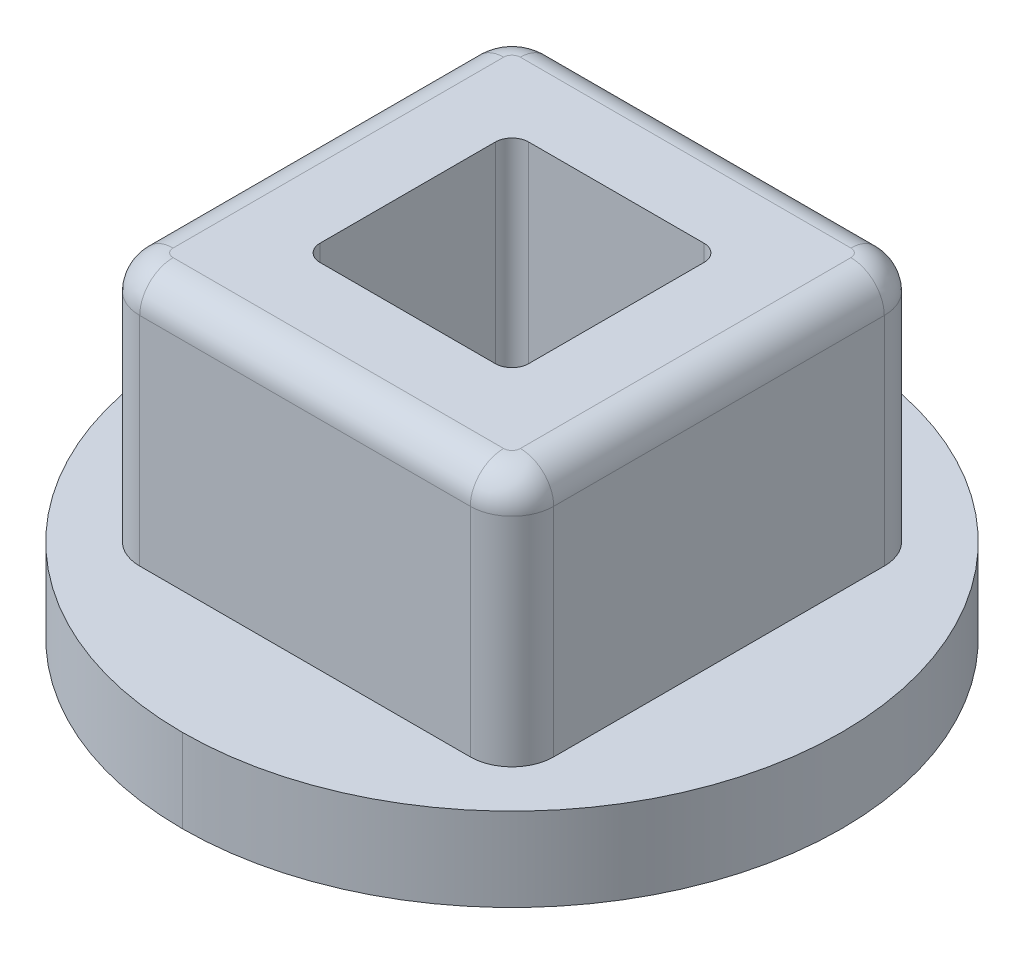
ISO-10303-21;
HEADER;
FILE_DESCRIPTION(('STEP AP214'),'2;1');
FILE_NAME('part.step','',(''),(''),'','','');
FILE_SCHEMA(('AUTOMOTIVE_DESIGN { 1 0 10303 214 1 1 1 1 }'));
ENDSEC;
DATA;
#1=APPLICATION_CONTEXT('core data for automotive mechanical design processes');
#2=APPLICATION_PROTOCOL_DEFINITION('international standard','automotive_design',2000,#1);
#3=PRODUCT_CONTEXT('',#1,'mechanical');
#4=PRODUCT('Part','Part','',(#3));
#5=PRODUCT_RELATED_PRODUCT_CATEGORY('part','',(#4));
#6=PRODUCT_DEFINITION_FORMATION('','',#4);
#7=PRODUCT_DEFINITION_CONTEXT('part definition',#1,'design');
#8=PRODUCT_DEFINITION('design','',#6,#7);
#9=PRODUCT_DEFINITION_SHAPE('','',#8);
#10=(LENGTH_UNIT() NAMED_UNIT(*) SI_UNIT(.MILLI.,.METRE.));
#11=(NAMED_UNIT(*) PLANE_ANGLE_UNIT() SI_UNIT($,.RADIAN.));
#12=(NAMED_UNIT(*) SI_UNIT($,.STERADIAN.) SOLID_ANGLE_UNIT());
#13=UNCERTAINTY_MEASURE_WITH_UNIT(LENGTH_MEASURE(1.E-05),#10,'distance_accuracy_value','');
#14=(GEOMETRIC_REPRESENTATION_CONTEXT(3) GLOBAL_UNCERTAINTY_ASSIGNED_CONTEXT((#13)) GLOBAL_UNIT_ASSIGNED_CONTEXT((#10,
#11,#12)) REPRESENTATION_CONTEXT('',''));
#15=CARTESIAN_POINT('',(0.,0.,0.));
#16=DIRECTION('',(0.,0.,1.));
#17=DIRECTION('',(1.,0.,0.));
#18=AXIS2_PLACEMENT_3D('',#15,#16,#17);
#19=CARTESIAN_POINT('',(-2.5146,5.08,-2.5146));
#20=DIRECTION('',(0.,-1.,0.));
#21=DIRECTION('',(0.,0.,-1.));
#22=AXIS2_PLACEMENT_3D('',#19,#20,#21);
#23=CYLINDRICAL_SURFACE('',#22,0.635);
#24=DIRECTION('',(0.,1.,0.));
#25=VECTOR('',#24,1.);
#26=CARTESIAN_POINT('',(-3.1496,5.08,-2.5146));
#27=LINE('',#26,#25);
#28=CARTESIAN_POINT('',(-3.1496,1.27,-2.5146));
#29=VERTEX_POINT('',#28);
#30=CARTESIAN_POINT('',(-3.1496,4.572,-2.5146));
#31=VERTEX_POINT('',#30);
#32=EDGE_CURVE('E9',#29,#31,#27,.T.);
#33=ORIENTED_EDGE('',*,*,#32,.T.);
#34=CARTESIAN_POINT('',(-2.5146,4.572,-2.5146));
#35=DIRECTION('',(0.,-1.,0.));
#36=DIRECTION('',(0.,0.,-1.));
#37=AXIS2_PLACEMENT_3D('',#34,#35,#36);
#38=CIRCLE('',#37,0.635);
#39=CARTESIAN_POINT('',(-2.51460000000017,4.572,-3.14959999999985));
#40=VERTEX_POINT('',#39);
#41=EDGE_CURVE('E308',#31,#40,#38,.T.);
#42=ORIENTED_EDGE('',*,*,#41,.T.);
#43=DIRECTION('',(0.,-1.,0.));
#44=VECTOR('',#43,1.);
#45=CARTESIAN_POINT('',(-2.5146,5.08,-3.1496));
#46=LINE('',#45,#44);
#47=CARTESIAN_POINT('',(-2.5146,1.27,-3.1496));
#48=VERTEX_POINT('',#47);
#49=EDGE_CURVE('E336',#40,#48,#46,.T.);
#50=ORIENTED_EDGE('',*,*,#49,.T.);
#51=CARTESIAN_POINT('',(-2.5146,1.27,-2.5146));
#52=DIRECTION('',(0.,1.,0.));
#53=DIRECTION('',(0.,0.,-1.));
#54=AXIS2_PLACEMENT_3D('',#51,#52,#53);
#55=CIRCLE('',#54,0.635);
#56=EDGE_CURVE('E324',#48,#29,#55,.T.);
#57=ORIENTED_EDGE('',*,*,#56,.T.);
#58=EDGE_LOOP('',(#33,#42,#50,#57));
#59=FACE_BOUND('',#58,.T.);
#60=ADVANCED_FACE('F14',(#59),#23,.T.);
#61=CARTESIAN_POINT('',(2.5146,5.08,-2.5146));
#62=DIRECTION('',(0.,-1.,0.));
#63=DIRECTION('',(0.,0.,-1.));
#64=AXIS2_PLACEMENT_3D('',#61,#62,#63);
#65=CYLINDRICAL_SURFACE('',#64,0.635);
#66=DIRECTION('',(0.,1.,0.));
#67=VECTOR('',#66,1.);
#68=CARTESIAN_POINT('',(2.5146,5.08,-3.1496));
#69=LINE('',#68,#67);
#70=CARTESIAN_POINT('',(2.5146,1.27,-3.1496));
#71=VERTEX_POINT('',#70);
#72=CARTESIAN_POINT('',(2.5146,4.572,-3.1496));
#73=VERTEX_POINT('',#72);
#74=EDGE_CURVE('E334',#71,#73,#69,.T.);
#75=ORIENTED_EDGE('',*,*,#74,.T.);
#76=CARTESIAN_POINT('',(2.5146,4.572,-2.5146));
#77=DIRECTION('',(0.,-1.,0.));
#78=DIRECTION('',(0.,0.,-1.));
#79=AXIS2_PLACEMENT_3D('',#76,#77,#78);
#80=CIRCLE('',#79,0.635);
#81=CARTESIAN_POINT('',(3.14959999999985,4.572,-2.51460000000017));
#82=VERTEX_POINT('',#81);
#83=EDGE_CURVE('E314',#73,#82,#80,.T.);
#84=ORIENTED_EDGE('',*,*,#83,.T.);
#85=DIRECTION('',(0.,-1.,0.));
#86=VECTOR('',#85,1.);
#87=CARTESIAN_POINT('',(3.1496,5.08,-2.5146));
#88=LINE('',#87,#86);
#89=CARTESIAN_POINT('',(3.1496,1.27,-2.5146));
#90=VERTEX_POINT('',#89);
#91=EDGE_CURVE('E288',#82,#90,#88,.T.);
#92=ORIENTED_EDGE('',*,*,#91,.T.);
#93=CARTESIAN_POINT('',(2.5146,1.27,-2.5146));
#94=DIRECTION('',(0.,1.,0.));
#95=DIRECTION('',(0.,0.,-1.));
#96=AXIS2_PLACEMENT_3D('',#93,#94,#95);
#97=CIRCLE('',#96,0.635);
#98=EDGE_CURVE('E283',#90,#71,#97,.T.);
#99=ORIENTED_EDGE('',*,*,#98,.T.);
#100=EDGE_LOOP('',(#75,#84,#92,#99));
#101=FACE_BOUND('',#100,.T.);
#102=ADVANCED_FACE('F851',(#101),#65,.T.);
#103=CARTESIAN_POINT('',(2.5146,5.08,2.5146));
#104=DIRECTION('',(0.,-1.,0.));
#105=DIRECTION('',(0.,0.,-1.));
#106=AXIS2_PLACEMENT_3D('',#103,#104,#105);
#107=CYLINDRICAL_SURFACE('',#106,0.635);
#108=DIRECTION('',(0.,1.,0.));
#109=VECTOR('',#108,1.);
#110=CARTESIAN_POINT('',(3.1496,5.08,2.5146));
#111=LINE('',#110,#109);
#112=CARTESIAN_POINT('',(3.1496,1.27,2.5146));
#113=VERTEX_POINT('',#112);
#114=CARTESIAN_POINT('',(3.1496,4.572,2.5146));
#115=VERTEX_POINT('',#114);
#116=EDGE_CURVE('E52',#113,#115,#111,.T.);
#117=ORIENTED_EDGE('',*,*,#116,.T.);
#118=CARTESIAN_POINT('',(2.5146,4.572,2.5146));
#119=DIRECTION('',(0.,-1.,0.));
#120=DIRECTION('',(0.,0.,-1.));
#121=AXIS2_PLACEMENT_3D('',#118,#119,#120);
#122=CIRCLE('',#121,0.635);
#123=CARTESIAN_POINT('',(2.51460000000008,4.572,3.14959999999985));
#124=VERTEX_POINT('',#123);
#125=EDGE_CURVE('E371',#115,#124,#122,.T.);
#126=ORIENTED_EDGE('',*,*,#125,.T.);
#127=DIRECTION('',(0.,-1.,0.));
#128=VECTOR('',#127,1.);
#129=CARTESIAN_POINT('',(2.5146,5.08,3.1496));
#130=LINE('',#129,#128);
#131=CARTESIAN_POINT('',(2.5146,1.27,3.1496));
#132=VERTEX_POINT('',#131);
#133=EDGE_CURVE('E38',#124,#132,#130,.T.);
#134=ORIENTED_EDGE('',*,*,#133,.T.);
#135=CARTESIAN_POINT('',(2.5146,1.27,2.5146));
#136=DIRECTION('',(0.,1.,0.));
#137=DIRECTION('',(0.,0.,-1.));
#138=AXIS2_PLACEMENT_3D('',#135,#136,#137);
#139=CIRCLE('',#138,0.635);
#140=EDGE_CURVE('E363',#132,#113,#139,.T.);
#141=ORIENTED_EDGE('',*,*,#140,.T.);
#142=EDGE_LOOP('',(#117,#126,#134,#141));
#143=FACE_BOUND('',#142,.T.);
#144=ADVANCED_FACE('F856',(#143),#107,.T.);
#145=CARTESIAN_POINT('',(-2.5146,5.08,2.5146));
#146=DIRECTION('',(0.,-1.,0.));
#147=DIRECTION('',(0.,0.,-1.));
#148=AXIS2_PLACEMENT_3D('',#145,#146,#147);
#149=CYLINDRICAL_SURFACE('',#148,0.635);
#150=DIRECTION('',(0.,1.,0.));
#151=VECTOR('',#150,1.);
#152=CARTESIAN_POINT('',(-2.5146,5.08,3.1496));
#153=LINE('',#152,#151);
#154=CARTESIAN_POINT('',(-2.5146,1.27,3.1496));
#155=VERTEX_POINT('',#154);
#156=CARTESIAN_POINT('',(-2.5146000000013,4.572,3.14959999999989));
#157=VERTEX_POINT('',#156);
#158=EDGE_CURVE('E291',#155,#157,#153,.T.);
#159=ORIENTED_EDGE('',*,*,#158,.T.);
#160=CARTESIAN_POINT('',(-2.5146,4.572,2.5146));
#161=DIRECTION('',(0.,-1.,0.));
#162=DIRECTION('',(0.,0.,-1.));
#163=AXIS2_PLACEMENT_3D('',#160,#161,#162);
#164=CIRCLE('',#163,0.635);
#165=CARTESIAN_POINT('',(-3.14959999999985,4.572,2.51460000000017));
#166=VERTEX_POINT('',#165);
#167=EDGE_CURVE('E329',#157,#166,#164,.T.);
#168=ORIENTED_EDGE('',*,*,#167,.T.);
#169=DIRECTION('',(0.,-1.,0.));
#170=VECTOR('',#169,1.);
#171=CARTESIAN_POINT('',(-3.1496,5.08,2.5146));
#172=LINE('',#171,#170);
#173=CARTESIAN_POINT('',(-3.1496,1.27,2.5146));
#174=VERTEX_POINT('',#173);
#175=EDGE_CURVE('E24',#166,#174,#172,.T.);
#176=ORIENTED_EDGE('',*,*,#175,.T.);
#177=CARTESIAN_POINT('',(-2.5146,1.27,2.5146));
#178=DIRECTION('',(0.,1.,0.));
#179=DIRECTION('',(0.,0.,-1.));
#180=AXIS2_PLACEMENT_3D('',#177,#178,#179);
#181=CIRCLE('',#180,0.635);
#182=EDGE_CURVE('E362',#174,#155,#181,.T.);
#183=ORIENTED_EDGE('',*,*,#182,.T.);
#184=EDGE_LOOP('',(#159,#168,#176,#183));
#185=FACE_BOUND('',#184,.T.);
#186=ADVANCED_FACE('F890',(#185),#149,.T.);
#187=CARTESIAN_POINT('',(-3.1496,5.08,-3.1496));
#188=DIRECTION('',(1.,0.,0.));
#189=DIRECTION('',(0.,1.,0.));
#190=AXIS2_PLACEMENT_3D('',#187,#188,#189);
#191=PLANE('',#190);
#192=DIRECTION('',(0.,0.,-1.));
#193=VECTOR('',#192,1.);
#194=CARTESIAN_POINT('',(-3.1496,1.27,0.));
#195=LINE('',#194,#193);
#196=EDGE_CURVE('E495',#174,#29,#195,.T.);
#197=ORIENTED_EDGE('',*,*,#196,.F.);
#198=ORIENTED_EDGE('',*,*,#175,.F.);
#199=DIRECTION('',(0.,0.,1.));
#200=VECTOR('',#199,1.);
#201=CARTESIAN_POINT('',(-3.1496,4.572,2.538898108304));
#202=LINE('',#201,#200);
#203=EDGE_CURVE('E309',#31,#166,#202,.T.);
#204=ORIENTED_EDGE('',*,*,#203,.F.);
#205=ORIENTED_EDGE('',*,*,#32,.F.);
#206=EDGE_LOOP('',(#197,#198,#204,#205));
#207=FACE_BOUND('',#206,.T.);
#208=ADVANCED_FACE('F887',(#207),#191,.F.);
#209=CARTESIAN_POINT('',(-3.1496,5.08,-3.1496));
#210=DIRECTION('',(0.,0.,1.));
#211=DIRECTION('',(1.,0.,0.));
#212=AXIS2_PLACEMENT_3D('',#209,#210,#211);
#213=PLANE('',#212);
#214=DIRECTION('',(1.,0.,0.));
#215=VECTOR('',#214,1.);
#216=CARTESIAN_POINT('',(0.,1.27,-3.1496));
#217=LINE('',#216,#215);
#218=EDGE_CURVE('E320',#48,#71,#217,.T.);
#219=ORIENTED_EDGE('',*,*,#218,.F.);
#220=ORIENTED_EDGE('',*,*,#49,.F.);
#221=DIRECTION('',(-1.,0.,0.));
#222=VECTOR('',#221,1.);
#223=CARTESIAN_POINT('',(-2.538898108304,4.572,-3.1496));
#224=LINE('',#223,#222);
#225=EDGE_CURVE('E315',#73,#40,#224,.T.);
#226=ORIENTED_EDGE('',*,*,#225,.F.);
#227=ORIENTED_EDGE('',*,*,#74,.F.);
#228=EDGE_LOOP('',(#219,#220,#226,#227));
#229=FACE_BOUND('',#228,.T.);
#230=ADVANCED_FACE('F884',(#229),#213,.F.);
#231=CARTESIAN_POINT('',(3.1496,5.08,-3.1496));
#232=DIRECTION('',(-1.,0.,0.));
#233=DIRECTION('',(0.,0.,1.));
#234=AXIS2_PLACEMENT_3D('',#231,#232,#233);
#235=PLANE('',#234);
#236=DIRECTION('',(0.,0.,1.));
#237=VECTOR('',#236,1.);
#238=CARTESIAN_POINT('',(3.1496,1.27,0.));
#239=LINE('',#238,#237);
#240=EDGE_CURVE('E278',#90,#113,#239,.T.);
#241=ORIENTED_EDGE('',*,*,#240,.F.);
#242=ORIENTED_EDGE('',*,*,#91,.F.);
#243=DIRECTION('',(0.,0.,-1.));
#244=VECTOR('',#243,1.);
#245=CARTESIAN_POINT('',(3.1496,4.572,-2.538898108304));
#246=LINE('',#245,#244);
#247=EDGE_CURVE('E298',#115,#82,#246,.T.);
#248=ORIENTED_EDGE('',*,*,#247,.F.);
#249=ORIENTED_EDGE('',*,*,#116,.F.);
#250=EDGE_LOOP('',(#241,#242,#248,#249));
#251=FACE_BOUND('',#250,.T.);
#252=ADVANCED_FACE('F886',(#251),#235,.F.);
#253=CARTESIAN_POINT('',(-3.1496,5.08,3.1496));
#254=DIRECTION('',(0.,0.,-1.));
#255=DIRECTION('',(0.,-1.,0.));
#256=AXIS2_PLACEMENT_3D('',#253,#254,#255);
#257=PLANE('',#256);
#258=DIRECTION('',(-1.,0.,0.));
#259=VECTOR('',#258,1.);
#260=CARTESIAN_POINT('',(0.,1.27,3.1496));
#261=LINE('',#260,#259);
#262=EDGE_CURVE('E358',#132,#155,#261,.T.);
#263=ORIENTED_EDGE('',*,*,#262,.F.);
#264=ORIENTED_EDGE('',*,*,#133,.F.);
#265=DIRECTION('',(1.,0.,0.));
#266=VECTOR('',#265,1.);
#267=CARTESIAN_POINT('',(2.538898108304,4.572,3.1496));
#268=LINE('',#267,#266);
#269=EDGE_CURVE('E434',#157,#124,#268,.T.);
#270=ORIENTED_EDGE('',*,*,#269,.F.);
#271=ORIENTED_EDGE('',*,*,#158,.F.);
#272=EDGE_LOOP('',(#263,#264,#270,#271));
#273=FACE_BOUND('',#272,.T.);
#274=ADVANCED_FACE('F904',(#273),#257,.F.);
#275=CARTESIAN_POINT('',(2.538898108304,4.572,2.6416));
#276=DIRECTION('',(-1.,0.,0.));
#277=DIRECTION('',(0.,0.,1.));
#278=AXIS2_PLACEMENT_3D('',#275,#276,#277);
#279=CYLINDRICAL_SURFACE('',#278,0.508);
#280=CARTESIAN_POINT('',(-2.51460000000044,4.57200000000061,2.64159999999975));
#281=DIRECTION('',(-1.,3.22548693439283E-13,-4.25399954763561E-12));
#282=DIRECTION('',(-4.25399954763561E-12,0.,1.));
#283=AXIS2_PLACEMENT_3D('',#280,#281,#282);
#284=CIRCLE('',#283,0.507999999999817);
#285=CARTESIAN_POINT('',(-2.51460000000014,5.08,2.64159999747238));
#286=VERTEX_POINT('',#285);
#287=EDGE_CURVE('E325',#157,#286,#284,.T.);
#288=ORIENTED_EDGE('',*,*,#287,.F.);
#289=ORIENTED_EDGE('',*,*,#269,.T.);
#290=CARTESIAN_POINT('',(2.5146,4.57200000000087,2.64159999999979));
#291=DIRECTION('',(1.,-2.47378686252884E-13,-6.43691683507636E-13));
#292=DIRECTION('',(-6.43691683507636E-13,0.,-1.));
#293=AXIS2_PLACEMENT_3D('',#290,#291,#292);
#294=CIRCLE('',#293,0.50799999999961);
#295=CARTESIAN_POINT('',(2.51460000000007,5.08,2.6415999974719));
#296=VERTEX_POINT('',#295);
#297=EDGE_CURVE('E302',#296,#124,#294,.T.);
#298=ORIENTED_EDGE('',*,*,#297,.F.);
#299=DIRECTION('',(1.,0.,0.));
#300=VECTOR('',#299,1.);
#301=CARTESIAN_POINT('',(-3.1496,5.08,2.641599994945));
#302=LINE('',#301,#300);
#303=EDGE_CURVE('E292',#286,#296,#302,.T.);
#304=ORIENTED_EDGE('',*,*,#303,.F.);
#305=EDGE_LOOP('',(#288,#289,#298,#304));
#306=FACE_BOUND('',#305,.T.);
#307=ADVANCED_FACE('F858',(#306),#279,.T.);
#308=CARTESIAN_POINT('',(2.51459999999958,4.57200000000093,2.51460000000043));
#309=DIRECTION('',(0.,-1.,0.));
#310=DIRECTION('',(0.,0.,-1.));
#311=AXIS2_PLACEMENT_3D('',#308,#309,#310);
#312=DEGENERATE_TOROIDAL_SURFACE('',#311,0.127000000000165,0.507999999999663,.T.);
#313=ORIENTED_EDGE('',*,*,#297,.T.);
#314=ORIENTED_EDGE('',*,*,#125,.F.);
#315=CARTESIAN_POINT('',(2.6416,4.572,2.5146));
#316=DIRECTION('',(0.,0.,-1.));
#317=DIRECTION('',(1.,0.,0.));
#318=AXIS2_PLACEMENT_3D('',#315,#316,#317);
#319=CIRCLE('',#318,0.508);
#320=CARTESIAN_POINT('',(2.6416,5.08,2.5146));
#321=VERTEX_POINT('',#320);
#322=EDGE_CURVE('E303',#321,#115,#319,.T.);
#323=ORIENTED_EDGE('',*,*,#322,.F.);
#324=CARTESIAN_POINT('',(2.51460000000007,5.08,2.6415999974719));
#325=CARTESIAN_POINT('',(2.54972105273951,5.08,2.64131640546551));
#326=CARTESIAN_POINT('',(2.57989162517371,5.08,2.62868309559753));
#327=CARTESIAN_POINT('',(2.62891349305956,5.08,2.580122019674));
#328=CARTESIAN_POINT('',(2.64131264002068,5.08,2.55018783379541));
#329=CARTESIAN_POINT('',(2.6416,5.08,2.5146));
#330=(BOUNDED_CURVE() B_SPLINE_CURVE(3,(#324,#325,#326,#327,#328,#329),.UNSPECIFIED.,.F.,
.F.) B_SPLINE_CURVE_WITH_KNOTS((4,2,4),(0.,0.5,1.),
.UNSPECIFIED.) CURVE() GEOMETRIC_REPRESENTATION_ITEM() RATIONAL_B_SPLINE_CURVE((1.,1.,1.,1.,1.,1.)) REPRESENTATION_ITEM(''));
#331=EDGE_CURVE('E296',#296,#321,#330,.T.);
#332=ORIENTED_EDGE('',*,*,#331,.F.);
#333=EDGE_LOOP('',(#313,#314,#323,#332));
#334=FACE_BOUND('',#333,.T.);
#335=ADVANCED_FACE('F879',(#334),#312,.T.);
#336=CARTESIAN_POINT('',(2.6416,4.572,-2.538898108304));
#337=DIRECTION('',(0.,0.,1.));
#338=DIRECTION('',(1.,0.,0.));
#339=AXIS2_PLACEMENT_3D('',#336,#337,#338);
#340=CYLINDRICAL_SURFACE('',#339,0.508);
#341=ORIENTED_EDGE('',*,*,#322,.T.);
#342=ORIENTED_EDGE('',*,*,#247,.T.);
#343=CARTESIAN_POINT('',(2.64159999999979,4.57200000000087,-2.5146));
#344=DIRECTION('',(-6.43691683507633E-13,-2.48759542019826E-13,-1.));
#345=DIRECTION('',(-1.,0.,6.43691683507633E-13));
#346=AXIS2_PLACEMENT_3D('',#343,#344,#345);
#347=CIRCLE('',#346,0.507999999999613);
#348=CARTESIAN_POINT('',(2.641599997472,5.08,-2.51460000000007));
#349=VERTEX_POINT('',#348);
#350=EDGE_CURVE('E310',#349,#82,#347,.T.);
#351=ORIENTED_EDGE('',*,*,#350,.F.);
#352=DIRECTION('',(0.,0.,-1.));
#353=VECTOR('',#352,1.);
#354=CARTESIAN_POINT('',(2.6416,5.08,3.1496));
#355=LINE('',#354,#353);
#356=EDGE_CURVE('E330',#321,#349,#355,.T.);
#357=ORIENTED_EDGE('',*,*,#356,.F.);
#358=EDGE_LOOP('',(#341,#342,#351,#357));
#359=FACE_BOUND('',#358,.T.);
#360=ADVANCED_FACE('F924',(#359),#340,.T.);
#361=CARTESIAN_POINT('',(2.51460000000043,4.57200000000093,-2.51459999999958));
#362=DIRECTION('',(0.,-1.,0.));
#363=DIRECTION('',(0.,0.,-1.));
#364=AXIS2_PLACEMENT_3D('',#361,#362,#363);
#365=DEGENERATE_TOROIDAL_SURFACE('',#364,0.127000000000165,0.507999999999663,.T.);
#366=ORIENTED_EDGE('',*,*,#350,.T.);
#367=ORIENTED_EDGE('',*,*,#83,.F.);
#368=CARTESIAN_POINT('',(2.5146,4.572,-2.6416));
#369=DIRECTION('',(-1.,0.,0.));
#370=DIRECTION('',(0.,0.,-1.));
#371=AXIS2_PLACEMENT_3D('',#368,#369,#370);
#372=CIRCLE('',#371,0.508);
#373=CARTESIAN_POINT('',(2.5146,5.08,-2.6416));
#374=VERTEX_POINT('',#373);
#375=EDGE_CURVE('E367',#374,#73,#372,.T.);
#376=ORIENTED_EDGE('',*,*,#375,.F.);
#377=CARTESIAN_POINT('',(2.641599997472,5.08,-2.51460000000007));
#378=CARTESIAN_POINT('',(2.64131640546551,5.08,-2.54972105273951));
#379=CARTESIAN_POINT('',(2.62868309559753,5.08,-2.57989162517371));
#380=CARTESIAN_POINT('',(2.580122019674,5.08,-2.62891349305956));
#381=CARTESIAN_POINT('',(2.55018783379541,5.08,-2.64131264002068));
#382=CARTESIAN_POINT('',(2.5146,5.08,-2.6416));
#383=(BOUNDED_CURVE() B_SPLINE_CURVE(3,(#377,#378,#379,#380,#381,#382),.UNSPECIFIED.,.F.,
.F.) B_SPLINE_CURVE_WITH_KNOTS((4,2,4),(0.,0.5,1.),
.UNSPECIFIED.) CURVE() GEOMETRIC_REPRESENTATION_ITEM() RATIONAL_B_SPLINE_CURVE((1.,1.,1.,1.,1.,1.)) REPRESENTATION_ITEM(''));
#384=EDGE_CURVE('E333',#349,#374,#383,.T.);
#385=ORIENTED_EDGE('',*,*,#384,.F.);
#386=EDGE_LOOP('',(#366,#367,#376,#385));
#387=FACE_BOUND('',#386,.T.);
#388=ADVANCED_FACE('F921',(#387),#365,.T.);
#389=CARTESIAN_POINT('',(-2.538898108304,4.572,-2.6416));
#390=DIRECTION('',(1.,0.,0.));
#391=DIRECTION('',(0.,0.,-1.));
#392=AXIS2_PLACEMENT_3D('',#389,#390,#391);
#393=CYLINDRICAL_SURFACE('',#392,0.508);
#394=ORIENTED_EDGE('',*,*,#375,.T.);
#395=ORIENTED_EDGE('',*,*,#225,.T.);
#396=CARTESIAN_POINT('',(-2.5146,4.57200000000087,-2.64159999999979));
#397=DIRECTION('',(-1.,-2.51373669764702E-13,6.47106493499715E-13));
#398=DIRECTION('',(6.47106493499715E-13,0.,1.));
#399=AXIS2_PLACEMENT_3D('',#396,#397,#398);
#400=CIRCLE('',#399,0.507999999999613);
#401=CARTESIAN_POINT('',(-2.51460000000007,5.08,-2.6415999974725));
#402=VERTEX_POINT('',#401);
#403=EDGE_CURVE('E304',#402,#40,#400,.T.);
#404=ORIENTED_EDGE('',*,*,#403,.F.);
#405=DIRECTION('',(-1.,0.,0.));
#406=VECTOR('',#405,1.);
#407=CARTESIAN_POINT('',(-3.1496,5.08,-2.6416));
#408=LINE('',#407,#406);
#409=EDGE_CURVE('E381',#374,#402,#408,.T.);
#410=ORIENTED_EDGE('',*,*,#409,.F.);
#411=EDGE_LOOP('',(#394,#395,#404,#410));
#412=FACE_BOUND('',#411,.T.);
#413=ADVANCED_FACE('F1121',(#412),#393,.T.);
#414=CARTESIAN_POINT('',(-2.51459999999958,4.57200000000093,-2.51460000000043));
#415=DIRECTION('',(0.,-1.,0.));
#416=DIRECTION('',(0.,0.,-1.));
#417=AXIS2_PLACEMENT_3D('',#414,#415,#416);
#418=DEGENERATE_TOROIDAL_SURFACE('',#417,0.127000000000165,0.507999999999663,.T.);
#419=ORIENTED_EDGE('',*,*,#403,.T.);
#420=ORIENTED_EDGE('',*,*,#41,.F.);
#421=CARTESIAN_POINT('',(-2.6416,4.572,-2.5146));
#422=DIRECTION('',(0.,0.,1.));
#423=DIRECTION('',(-1.,0.,0.));
#424=AXIS2_PLACEMENT_3D('',#421,#422,#423);
#425=CIRCLE('',#424,0.508);
#426=CARTESIAN_POINT('',(-2.6416,5.08,-2.5146));
#427=VERTEX_POINT('',#426);
#428=EDGE_CURVE('E328',#427,#31,#425,.T.);
#429=ORIENTED_EDGE('',*,*,#428,.F.);
#430=CARTESIAN_POINT('',(-2.51460000000007,5.08,-2.6415999974725));
#431=CARTESIAN_POINT('',(-2.54972105273957,5.08,-2.64131640546624));
#432=CARTESIAN_POINT('',(-2.57989162517371,5.08,-2.62868309559808));
#433=CARTESIAN_POINT('',(-2.62891349305956,5.08,-2.58012201967404));
#434=CARTESIAN_POINT('',(-2.64131264002068,5.08,-2.55018783379536));
#435=CARTESIAN_POINT('',(-2.6416,5.08,-2.5146));
#436=(BOUNDED_CURVE() B_SPLINE_CURVE(3,(#430,#431,#432,#433,#434,#435),.UNSPECIFIED.,.F.,
.F.) B_SPLINE_CURVE_WITH_KNOTS((4,2,4),(0.,0.5,1.),
.UNSPECIFIED.) CURVE() GEOMETRIC_REPRESENTATION_ITEM() RATIONAL_B_SPLINE_CURVE((1.,1.,1.,1.,1.,1.)) REPRESENTATION_ITEM(''));
#437=EDGE_CURVE('E433',#402,#427,#436,.T.);
#438=ORIENTED_EDGE('',*,*,#437,.F.);
#439=EDGE_LOOP('',(#419,#420,#429,#438));
#440=FACE_BOUND('',#439,.T.);
#441=ADVANCED_FACE('F517',(#440),#418,.T.);
#442=CARTESIAN_POINT('',(-2.6416,4.572,2.538898108304));
#443=DIRECTION('',(0.,0.,-1.));
#444=DIRECTION('',(-1.,0.,0.));
#445=AXIS2_PLACEMENT_3D('',#442,#443,#444);
#446=CYLINDRICAL_SURFACE('',#445,0.508);
#447=ORIENTED_EDGE('',*,*,#428,.T.);
#448=ORIENTED_EDGE('',*,*,#203,.T.);
#449=CARTESIAN_POINT('',(-2.64159999999979,4.57200000000087,2.5146));
#450=DIRECTION('',(6.47106493499715E-13,-2.51373669764702E-13,1.));
#451=DIRECTION('',(1.,0.,-6.47106493499715E-13));
#452=AXIS2_PLACEMENT_3D('',#449,#450,#451);
#453=CIRCLE('',#452,0.507999999999613);
#454=CARTESIAN_POINT('',(-2.6415999974725,5.08,2.51460000000007));
#455=VERTEX_POINT('',#454);
#456=EDGE_CURVE('E282',#455,#166,#453,.T.);
#457=ORIENTED_EDGE('',*,*,#456,.F.);
#458=DIRECTION('',(0.,0.,1.));
#459=VECTOR('',#458,1.);
#460=CARTESIAN_POINT('',(-2.6416,5.08,3.1496));
#461=LINE('',#460,#459);
#462=EDGE_CURVE('E374',#427,#455,#461,.T.);
#463=ORIENTED_EDGE('',*,*,#462,.F.);
#464=EDGE_LOOP('',(#447,#448,#457,#463));
#465=FACE_BOUND('',#464,.T.);
#466=ADVANCED_FACE('F512',(#465),#446,.T.);
#467=CARTESIAN_POINT('',(-2.51460000000043,4.57200000000093,2.51459999999958));
#468=DIRECTION('',(0.,-1.,0.));
#469=DIRECTION('',(0.,0.,-1.));
#470=AXIS2_PLACEMENT_3D('',#467,#468,#469);
#471=DEGENERATE_TOROIDAL_SURFACE('',#470,0.127000000000165,0.507999999999663,.T.);
#472=ORIENTED_EDGE('',*,*,#456,.T.);
#473=ORIENTED_EDGE('',*,*,#167,.F.);
#474=ORIENTED_EDGE('',*,*,#287,.T.);
#475=CARTESIAN_POINT('',(-2.6415999974725,5.08,2.51460000000007));
#476=CARTESIAN_POINT('',(-2.64131640546624,5.08,2.54972105272819));
#477=CARTESIAN_POINT('',(-2.62868309559799,5.08,2.57989162465958));
#478=CARTESIAN_POINT('',(-2.58012201967414,5.08,2.62891349061254));
#479=CARTESIAN_POINT('',(-2.55018783379544,5.08,2.64131263638219));
#480=CARTESIAN_POINT('',(-2.51460000000014,5.08,2.64159999747238));
#481=(BOUNDED_CURVE() B_SPLINE_CURVE(3,(#475,#476,#477,#478,#479,#480),.UNSPECIFIED.,.F.,
.F.) B_SPLINE_CURVE_WITH_KNOTS((4,2,4),(0.,0.5,1.),
.UNSPECIFIED.) CURVE() GEOMETRIC_REPRESENTATION_ITEM() RATIONAL_B_SPLINE_CURVE((1.,1.,1.,1.,1.,1.)) REPRESENTATION_ITEM(''));
#482=EDGE_CURVE('E297',#455,#286,#481,.T.);
#483=ORIENTED_EDGE('',*,*,#482,.F.);
#484=EDGE_LOOP('',(#472,#473,#474,#483));
#485=FACE_BOUND('',#484,.T.);
#486=ADVANCED_FACE('F1140',(#485),#471,.T.);
#487=CARTESIAN_POINT('',(0.,1.27,0.));
#488=DIRECTION('',(0.,1.,0.));
#489=DIRECTION('',(1.,0.,0.));
#490=AXIS2_PLACEMENT_3D('',#487,#488,#489);
#491=PLANE('',#490);
#492=ORIENTED_EDGE('',*,*,#140,.F.);
#493=ORIENTED_EDGE('',*,*,#262,.T.);
#494=ORIENTED_EDGE('',*,*,#182,.F.);
#495=ORIENTED_EDGE('',*,*,#196,.T.);
#496=ORIENTED_EDGE('',*,*,#56,.F.);
#497=ORIENTED_EDGE('',*,*,#218,.T.);
#498=ORIENTED_EDGE('',*,*,#98,.F.);
#499=ORIENTED_EDGE('',*,*,#240,.T.);
#500=EDGE_LOOP('',(#492,#493,#494,#495,#496,#497,#498,#499));
#501=FACE_BOUND('',#500,.T.);
#502=CARTESIAN_POINT('',(0.,1.27,0.));
#503=DIRECTION('',(0.,-1.,0.));
#504=DIRECTION('',(0.,0.,-1.));
#505=AXIS2_PLACEMENT_3D('',#502,#503,#504);
#506=CIRCLE('',#505,5.0165);
#507=CARTESIAN_POINT('',(0.,1.27,-5.0165));
#508=VERTEX_POINT('',#507);
#509=CARTESIAN_POINT('',(0.,1.27,5.0165));
#510=VERTEX_POINT('',#509);
#511=EDGE_CURVE('E821',#508,#510,#506,.T.);
#512=ORIENTED_EDGE('',*,*,#511,.F.);
#513=CARTESIAN_POINT('',(0.,1.27,0.));
#514=DIRECTION('',(0.,-1.,0.));
#515=DIRECTION('',(0.,0.,-1.));
#516=AXIS2_PLACEMENT_3D('',#513,#514,#515);
#517=CIRCLE('',#516,5.0165);
#518=EDGE_CURVE('E375',#510,#508,#517,.T.);
#519=ORIENTED_EDGE('',*,*,#518,.F.);
#520=EDGE_LOOP('',(#512,#519));
#521=FACE_BOUND('',#520,.T.);
#522=ADVANCED_FACE('F915',(#501,#521),#491,.T.);
#523=CARTESIAN_POINT('',(1.3335,5.08,-1.3335));
#524=DIRECTION('',(0.,1.,0.));
#525=DIRECTION('',(0.,0.,1.));
#526=AXIS2_PLACEMENT_3D('',#523,#524,#525);
#527=CYLINDRICAL_SURFACE('',#526,0.254);
#528=CARTESIAN_POINT('',(1.3335,0.,-1.3335));
#529=DIRECTION('',(0.,1.,0.));
#530=DIRECTION('',(0.,0.,1.));
#531=AXIS2_PLACEMENT_3D('',#528,#529,#530);
#532=CIRCLE('',#531,0.254);
#533=CARTESIAN_POINT('',(1.5875,0.,-1.3335));
#534=VERTEX_POINT('',#533);
#535=CARTESIAN_POINT('',(1.3335,0.,-1.5875));
#536=VERTEX_POINT('',#535);
#537=EDGE_CURVE('E272',#534,#536,#532,.T.);
#538=ORIENTED_EDGE('',*,*,#537,.F.);
#539=DIRECTION('',(0.,1.,0.));
#540=VECTOR('',#539,1.);
#541=CARTESIAN_POINT('',(1.5875,5.08,-1.3335));
#542=LINE('',#541,#540);
#543=CARTESIAN_POINT('',(1.5875,5.08,-1.3335));
#544=VERTEX_POINT('',#543);
#545=EDGE_CURVE('E392',#534,#544,#542,.T.);
#546=ORIENTED_EDGE('',*,*,#545,.T.);
#547=CARTESIAN_POINT('',(1.3335,5.08,-1.3335));
#548=DIRECTION('',(0.,-1.,0.));
#549=DIRECTION('',(0.,0.,1.));
#550=AXIS2_PLACEMENT_3D('',#547,#548,#549);
#551=CIRCLE('',#550,0.254);
#552=CARTESIAN_POINT('',(1.3335,5.08,-1.5875));
#553=VERTEX_POINT('',#552);
#554=EDGE_CURVE('E270',#553,#544,#551,.T.);
#555=ORIENTED_EDGE('',*,*,#554,.F.);
#556=DIRECTION('',(0.,-1.,0.));
#557=VECTOR('',#556,1.);
#558=CARTESIAN_POINT('',(1.3335,5.08,-1.5875));
#559=LINE('',#558,#557);
#560=EDGE_CURVE('E396',#553,#536,#559,.T.);
#561=ORIENTED_EDGE('',*,*,#560,.T.);
#562=EDGE_LOOP('',(#538,#546,#555,#561));
#563=FACE_BOUND('',#562,.T.);
#564=ADVANCED_FACE('F1127',(#563),#527,.F.);
#565=CARTESIAN_POINT('',(1.3335,5.08,1.3335));
#566=DIRECTION('',(0.,1.,0.));
#567=DIRECTION('',(0.,0.,1.));
#568=AXIS2_PLACEMENT_3D('',#565,#566,#567);
#569=CYLINDRICAL_SURFACE('',#568,0.254);
#570=CARTESIAN_POINT('',(1.3335,0.,1.3335));
#571=DIRECTION('',(0.,1.,0.));
#572=DIRECTION('',(0.,0.,1.));
#573=AXIS2_PLACEMENT_3D('',#570,#571,#572);
#574=CIRCLE('',#573,0.254);
#575=CARTESIAN_POINT('',(1.3335,0.,1.5875));
#576=VERTEX_POINT('',#575);
#577=CARTESIAN_POINT('',(1.5875,0.,1.3335));
#578=VERTEX_POINT('',#577);
#579=EDGE_CURVE('E287',#576,#578,#574,.T.);
#580=ORIENTED_EDGE('',*,*,#579,.F.);
#581=DIRECTION('',(0.,1.,0.));
#582=VECTOR('',#581,1.);
#583=CARTESIAN_POINT('',(1.3335,5.08,1.5875));
#584=LINE('',#583,#582);
#585=CARTESIAN_POINT('',(1.3335,5.08,1.5875));
#586=VERTEX_POINT('',#585);
#587=EDGE_CURVE('E391',#576,#586,#584,.T.);
#588=ORIENTED_EDGE('',*,*,#587,.T.);
#589=CARTESIAN_POINT('',(1.3335,5.08,1.3335));
#590=DIRECTION('',(0.,-1.,0.));
#591=DIRECTION('',(0.,0.,1.));
#592=AXIS2_PLACEMENT_3D('',#589,#590,#591);
#593=CIRCLE('',#592,0.254);
#594=CARTESIAN_POINT('',(1.5875,5.08,1.3335));
#595=VERTEX_POINT('',#594);
#596=EDGE_CURVE('E430',#595,#586,#593,.T.);
#597=ORIENTED_EDGE('',*,*,#596,.F.);
#598=DIRECTION('',(0.,-1.,0.));
#599=VECTOR('',#598,1.);
#600=CARTESIAN_POINT('',(1.5875,5.08,1.3335));
#601=LINE('',#600,#599);
#602=EDGE_CURVE('E411',#595,#578,#601,.T.);
#603=ORIENTED_EDGE('',*,*,#602,.T.);
#604=EDGE_LOOP('',(#580,#588,#597,#603));
#605=FACE_BOUND('',#604,.T.);
#606=ADVANCED_FACE('F883',(#605),#569,.F.);
#607=CARTESIAN_POINT('',(-1.3335,5.08,1.3335));
#608=DIRECTION('',(0.,1.,0.));
#609=DIRECTION('',(0.,0.,1.));
#610=AXIS2_PLACEMENT_3D('',#607,#608,#609);
#611=CYLINDRICAL_SURFACE('',#610,0.254);
#612=CARTESIAN_POINT('',(-1.3335,0.,1.3335));
#613=DIRECTION('',(0.,1.,0.));
#614=DIRECTION('',(0.,0.,1.));
#615=AXIS2_PLACEMENT_3D('',#612,#613,#614);
#616=CIRCLE('',#615,0.254);
#617=CARTESIAN_POINT('',(-1.5875,0.,1.3335));
#618=VERTEX_POINT('',#617);
#619=CARTESIAN_POINT('',(-1.3335,0.,1.5875));
#620=VERTEX_POINT('',#619);
#621=EDGE_CURVE('E243',#618,#620,#616,.T.);
#622=ORIENTED_EDGE('',*,*,#621,.F.);
#623=DIRECTION('',(0.,1.,0.));
#624=VECTOR('',#623,1.);
#625=CARTESIAN_POINT('',(-1.5875,5.08,1.3335));
#626=LINE('',#625,#624);
#627=CARTESIAN_POINT('',(-1.5875,5.08,1.3335));
#628=VERTEX_POINT('',#627);
#629=EDGE_CURVE('E232',#618,#628,#626,.T.);
#630=ORIENTED_EDGE('',*,*,#629,.T.);
#631=CARTESIAN_POINT('',(-1.3335,5.08,1.3335));
#632=DIRECTION('',(0.,-1.,0.));
#633=DIRECTION('',(0.,0.,1.));
#634=AXIS2_PLACEMENT_3D('',#631,#632,#633);
#635=CIRCLE('',#634,0.254);
#636=CARTESIAN_POINT('',(-1.3335,5.08,1.5875));
#637=VERTEX_POINT('',#636);
#638=EDGE_CURVE('E202',#637,#628,#635,.T.);
#639=ORIENTED_EDGE('',*,*,#638,.F.);
#640=DIRECTION('',(0.,-1.,0.));
#641=VECTOR('',#640,1.);
#642=CARTESIAN_POINT('',(-1.3335,5.08,1.5875));
#643=LINE('',#642,#641);
#644=EDGE_CURVE('E246',#637,#620,#643,.T.);
#645=ORIENTED_EDGE('',*,*,#644,.T.);
#646=EDGE_LOOP('',(#622,#630,#639,#645));
#647=FACE_BOUND('',#646,.T.);
#648=ADVANCED_FACE('F244',(#647),#611,.F.);
#649=CARTESIAN_POINT('',(-3.1496,5.08,3.1496));
#650=DIRECTION('',(0.,1.,0.));
#651=DIRECTION('',(1.,0.,0.));
#652=AXIS2_PLACEMENT_3D('',#649,#650,#651);
#653=PLANE('',#652);
#654=ORIENTED_EDGE('',*,*,#596,.T.);
#655=DIRECTION('',(-1.,0.,0.));
#656=VECTOR('',#655,1.);
#657=CARTESIAN_POINT('',(-1.5875,5.08,1.5875));
#658=LINE('',#657,#656);
#659=EDGE_CURVE('E388',#586,#637,#658,.T.);
#660=ORIENTED_EDGE('',*,*,#659,.T.);
#661=ORIENTED_EDGE('',*,*,#638,.T.);
#662=DIRECTION('',(0.,0.,-1.));
#663=VECTOR('',#662,1.);
#664=CARTESIAN_POINT('',(-1.5875,5.08,1.5875));
#665=LINE('',#664,#663);
#666=CARTESIAN_POINT('',(-1.5875,5.08,-1.3335));
#667=VERTEX_POINT('',#666);
#668=EDGE_CURVE('E237',#628,#667,#665,.T.);
#669=ORIENTED_EDGE('',*,*,#668,.T.);
#670=CARTESIAN_POINT('',(-1.3335,5.08,-1.3335));
#671=DIRECTION('',(0.,-1.,0.));
#672=DIRECTION('',(0.,0.,1.));
#673=AXIS2_PLACEMENT_3D('',#670,#671,#672);
#674=CIRCLE('',#673,0.254);
#675=CARTESIAN_POINT('',(-1.3335,5.08,-1.5875));
#676=VERTEX_POINT('',#675);
#677=EDGE_CURVE('E211',#667,#676,#674,.T.);
#678=ORIENTED_EDGE('',*,*,#677,.T.);
#679=DIRECTION('',(1.,0.,0.));
#680=VECTOR('',#679,1.);
#681=CARTESIAN_POINT('',(-1.5875,5.08,-1.5875));
#682=LINE('',#681,#680);
#683=EDGE_CURVE('E452',#676,#553,#682,.T.);
#684=ORIENTED_EDGE('',*,*,#683,.T.);
#685=ORIENTED_EDGE('',*,*,#554,.T.);
#686=DIRECTION('',(0.,0.,1.));
#687=VECTOR('',#686,1.);
#688=CARTESIAN_POINT('',(1.5875,5.08,1.5875));
#689=LINE('',#688,#687);
#690=EDGE_CURVE('E397',#544,#595,#689,.T.);
#691=ORIENTED_EDGE('',*,*,#690,.T.);
#692=EDGE_LOOP('',(#654,#660,#661,#669,#678,#684,#685,#691));
#693=FACE_BOUND('',#692,.T.);
#694=ORIENTED_EDGE('',*,*,#462,.T.);
#695=ORIENTED_EDGE('',*,*,#482,.T.);
#696=ORIENTED_EDGE('',*,*,#303,.T.);
#697=ORIENTED_EDGE('',*,*,#331,.T.);
#698=ORIENTED_EDGE('',*,*,#356,.T.);
#699=ORIENTED_EDGE('',*,*,#384,.T.);
#700=ORIENTED_EDGE('',*,*,#409,.T.);
#701=ORIENTED_EDGE('',*,*,#437,.T.);
#702=EDGE_LOOP('',(#694,#695,#696,#697,#698,#699,#700,#701));
#703=FACE_BOUND('',#702,.T.);
#704=ADVANCED_FACE('F519',(#693,#703),#653,.T.);
#705=CARTESIAN_POINT('',(-1.3335,5.08,-1.3335));
#706=DIRECTION('',(0.,1.,0.));
#707=DIRECTION('',(0.,0.,1.));
#708=AXIS2_PLACEMENT_3D('',#705,#706,#707);
#709=CYLINDRICAL_SURFACE('',#708,0.254);
#710=CARTESIAN_POINT('',(-1.3335,0.,-1.3335));
#711=DIRECTION('',(0.,1.,0.));
#712=DIRECTION('',(0.,0.,1.));
#713=AXIS2_PLACEMENT_3D('',#710,#711,#712);
#714=CIRCLE('',#713,0.254);
#715=CARTESIAN_POINT('',(-1.3335,0.,-1.5875));
#716=VERTEX_POINT('',#715);
#717=CARTESIAN_POINT('',(-1.5875,0.,-1.3335));
#718=VERTEX_POINT('',#717);
#719=EDGE_CURVE('E258',#716,#718,#714,.T.);
#720=ORIENTED_EDGE('',*,*,#719,.F.);
#721=DIRECTION('',(0.,1.,0.));
#722=VECTOR('',#721,1.);
#723=CARTESIAN_POINT('',(-1.3335,5.08,-1.5875));
#724=LINE('',#723,#722);
#725=EDGE_CURVE('E450',#716,#676,#724,.T.);
#726=ORIENTED_EDGE('',*,*,#725,.T.);
#727=ORIENTED_EDGE('',*,*,#677,.F.);
#728=DIRECTION('',(0.,-1.,0.));
#729=VECTOR('',#728,1.);
#730=CARTESIAN_POINT('',(-1.5875,5.08,-1.3335));
#731=LINE('',#730,#729);
#732=EDGE_CURVE('E240',#667,#718,#731,.T.);
#733=ORIENTED_EDGE('',*,*,#732,.T.);
#734=EDGE_LOOP('',(#720,#726,#727,#733));
#735=FACE_BOUND('',#734,.T.);
#736=ADVANCED_FACE('F865',(#735),#709,.F.);
#737=CARTESIAN_POINT('',(0.,1.27,0.));
#738=DIRECTION('',(0.,-1.,0.));
#739=DIRECTION('',(0.,0.,-1.));
#740=AXIS2_PLACEMENT_3D('',#737,#738,#739);
#741=CYLINDRICAL_SURFACE('',#740,5.0165);
#742=DIRECTION('',(0.,-1.,0.));
#743=VECTOR('',#742,1.);
#744=CARTESIAN_POINT('',(0.,1.27,5.0165));
#745=LINE('',#744,#743);
#746=CARTESIAN_POINT('',(0.,0.,5.0165));
#747=VERTEX_POINT('',#746);
#748=EDGE_CURVE('E18',#510,#747,#745,.T.);
#749=ORIENTED_EDGE('',*,*,#748,.F.);
#750=ORIENTED_EDGE('',*,*,#518,.T.);
#751=DIRECTION('',(0.,-1.,0.));
#752=VECTOR('',#751,1.);
#753=CARTESIAN_POINT('',(0.,1.27,-5.0165));
#754=LINE('',#753,#752);
#755=CARTESIAN_POINT('',(0.,0.,-5.0165));
#756=VERTEX_POINT('',#755);
#757=EDGE_CURVE('E266',#508,#756,#754,.T.);
#758=ORIENTED_EDGE('',*,*,#757,.T.);
#759=CARTESIAN_POINT('',(0.,0.,0.));
#760=DIRECTION('',(0.,1.,0.));
#761=DIRECTION('',(0.,0.,-1.));
#762=AXIS2_PLACEMENT_3D('',#759,#760,#761);
#763=CIRCLE('',#762,5.0165);
#764=EDGE_CURVE('E260',#756,#747,#763,.T.);
#765=ORIENTED_EDGE('',*,*,#764,.T.);
#766=EDGE_LOOP('',(#749,#750,#758,#765));
#767=FACE_BOUND('',#766,.T.);
#768=ADVANCED_FACE('F837',(#767),#741,.T.);
#769=CARTESIAN_POINT('',(-1.5875,5.08,-1.5875));
#770=DIRECTION('',(0.,0.,-1.));
#771=DIRECTION('',(0.,-1.,0.));
#772=AXIS2_PLACEMENT_3D('',#769,#770,#771);
#773=PLANE('',#772);
#774=DIRECTION('',(1.,0.,0.));
#775=VECTOR('',#774,1.);
#776=CARTESIAN_POINT('',(0.,0.,-1.5875));
#777=LINE('',#776,#775);
#778=EDGE_CURVE('E276',#716,#536,#777,.T.);
#779=ORIENTED_EDGE('',*,*,#778,.T.);
#780=ORIENTED_EDGE('',*,*,#560,.F.);
#781=ORIENTED_EDGE('',*,*,#683,.F.);
#782=ORIENTED_EDGE('',*,*,#725,.F.);
#783=EDGE_LOOP('',(#779,#780,#781,#782));
#784=FACE_BOUND('',#783,.T.);
#785=ADVANCED_FACE('F864',(#784),#773,.F.);
#786=CARTESIAN_POINT('',(1.5875,5.08,1.5875));
#787=DIRECTION('',(1.,0.,0.));
#788=DIRECTION('',(0.,1.,0.));
#789=AXIS2_PLACEMENT_3D('',#786,#787,#788);
#790=PLANE('',#789);
#791=DIRECTION('',(0.,0.,1.));
#792=VECTOR('',#791,1.);
#793=CARTESIAN_POINT('',(1.5875,0.,0.));
#794=LINE('',#793,#792);
#795=EDGE_CURVE('E277',#534,#578,#794,.T.);
#796=ORIENTED_EDGE('',*,*,#795,.T.);
#797=ORIENTED_EDGE('',*,*,#602,.F.);
#798=ORIENTED_EDGE('',*,*,#690,.F.);
#799=ORIENTED_EDGE('',*,*,#545,.F.);
#800=EDGE_LOOP('',(#796,#797,#798,#799));
#801=FACE_BOUND('',#800,.T.);
#802=ADVANCED_FACE('F16',(#801),#790,.F.);
#803=CARTESIAN_POINT('',(-1.5875,5.08,1.5875));
#804=DIRECTION('',(0.,0.,1.));
#805=DIRECTION('',(1.,0.,0.));
#806=AXIS2_PLACEMENT_3D('',#803,#804,#805);
#807=PLANE('',#806);
#808=DIRECTION('',(-1.,0.,0.));
#809=VECTOR('',#808,1.);
#810=CARTESIAN_POINT('',(0.,0.,1.5875));
#811=LINE('',#810,#809);
#812=EDGE_CURVE('E251',#576,#620,#811,.T.);
#813=ORIENTED_EDGE('',*,*,#812,.T.);
#814=ORIENTED_EDGE('',*,*,#644,.F.);
#815=ORIENTED_EDGE('',*,*,#659,.F.);
#816=ORIENTED_EDGE('',*,*,#587,.F.);
#817=EDGE_LOOP('',(#813,#814,#815,#816));
#818=FACE_BOUND('',#817,.T.);
#819=ADVANCED_FACE('F846',(#818),#807,.F.);
#820=CARTESIAN_POINT('',(-1.5875,5.08,1.5875));
#821=DIRECTION('',(-1.,0.,0.));
#822=DIRECTION('',(0.,0.,1.));
#823=AXIS2_PLACEMENT_3D('',#820,#821,#822);
#824=PLANE('',#823);
#825=ORIENTED_EDGE('',*,*,#668,.F.);
#826=ORIENTED_EDGE('',*,*,#629,.F.);
#827=DIRECTION('',(0.,0.,-1.));
#828=VECTOR('',#827,1.);
#829=CARTESIAN_POINT('',(-1.5875,0.,0.));
#830=LINE('',#829,#828);
#831=EDGE_CURVE('E236',#618,#718,#830,.T.);
#832=ORIENTED_EDGE('',*,*,#831,.T.);
#833=ORIENTED_EDGE('',*,*,#732,.F.);
#834=EDGE_LOOP('',(#825,#826,#832,#833));
#835=FACE_BOUND('',#834,.T.);
#836=ADVANCED_FACE('F234',(#835),#824,.F.);
#837=CARTESIAN_POINT('',(0.,0.,0.));
#838=DIRECTION('',(0.,1.,0.));
#839=DIRECTION('',(1.,0.,0.));
#840=AXIS2_PLACEMENT_3D('',#837,#838,#839);
#841=PLANE('',#840);
#842=ORIENTED_EDGE('',*,*,#831,.F.);
#843=ORIENTED_EDGE('',*,*,#621,.T.);
#844=ORIENTED_EDGE('',*,*,#812,.F.);
#845=ORIENTED_EDGE('',*,*,#579,.T.);
#846=ORIENTED_EDGE('',*,*,#795,.F.);
#847=ORIENTED_EDGE('',*,*,#537,.T.);
#848=ORIENTED_EDGE('',*,*,#778,.F.);
#849=ORIENTED_EDGE('',*,*,#719,.T.);
#850=EDGE_LOOP('',(#842,#843,#844,#845,#846,#847,#848,#849));
#851=FACE_BOUND('',#850,.T.);
#852=ORIENTED_EDGE('',*,*,#764,.F.);
#853=CARTESIAN_POINT('',(0.,0.,0.));
#854=DIRECTION('',(0.,1.,0.));
#855=DIRECTION('',(0.,0.,-1.));
#856=AXIS2_PLACEMENT_3D('',#853,#854,#855);
#857=CIRCLE('',#856,5.0165);
#858=EDGE_CURVE('E406',#747,#756,#857,.T.);
#859=ORIENTED_EDGE('',*,*,#858,.F.);
#860=EDGE_LOOP('',(#852,#859));
#861=FACE_BOUND('',#860,.T.);
#862=ADVANCED_FACE('F254',(#851,#861),#841,.F.);
#863=CARTESIAN_POINT('',(0.,1.27,0.));
#864=DIRECTION('',(0.,-1.,0.));
#865=DIRECTION('',(0.,0.,-1.));
#866=AXIS2_PLACEMENT_3D('',#863,#864,#865);
#867=CYLINDRICAL_SURFACE('',#866,5.0165);
#868=ORIENTED_EDGE('',*,*,#511,.T.);
#869=ORIENTED_EDGE('',*,*,#748,.T.);
#870=ORIENTED_EDGE('',*,*,#858,.T.);
#871=ORIENTED_EDGE('',*,*,#757,.F.);
#872=EDGE_LOOP('',(#868,#869,#870,#871));
#873=FACE_BOUND('',#872,.T.);
#874=ADVANCED_FACE('F834',(#873),#867,.T.);
#875=CLOSED_SHELL('',(#60,#102,#144,#186,#208,#230,#252,#274,#307,#335,#360,#388,#413,#441,#466,
#486,#522,#564,#606,#648,#704,#736,#768,#785,#802,#819,#836,#862,#874));
#876=MANIFOLD_SOLID_BREP('B1',#875);
#877=ADVANCED_BREP_SHAPE_REPRESENTATION('',(#18,#876),#14);
#878=SHAPE_DEFINITION_REPRESENTATION(#9,#877);
ENDSEC;
END-ISO-10303-21;
